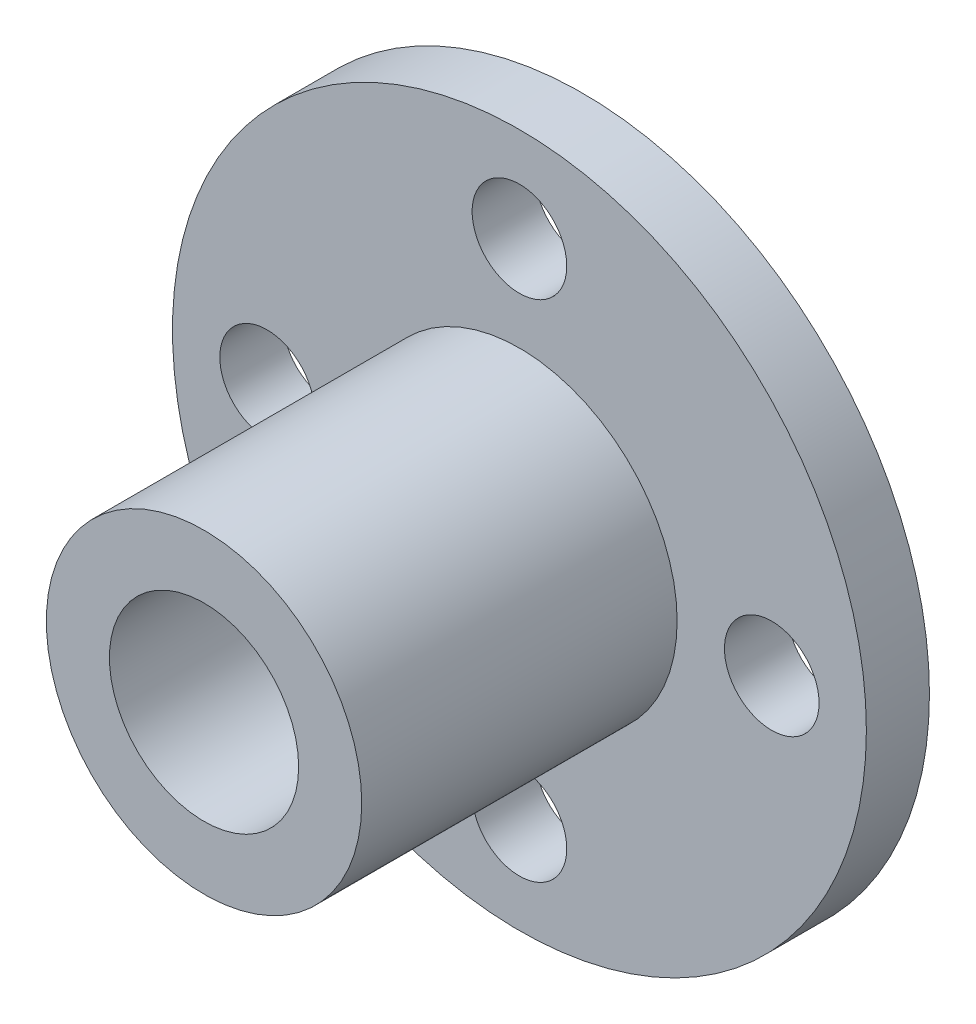
ISO-10303-21;
HEADER;
FILE_DESCRIPTION(('STEP AP214'),'2;1');
FILE_NAME('part.step','',(''),(''),'','','');
FILE_SCHEMA(('AUTOMOTIVE_DESIGN { 1 0 10303 214 1 1 1 1 }'));
ENDSEC;
DATA;
#1=APPLICATION_CONTEXT('core data for automotive mechanical design processes');
#2=APPLICATION_PROTOCOL_DEFINITION('international standard','automotive_design',2000,#1);
#3=PRODUCT_CONTEXT('',#1,'mechanical');
#4=PRODUCT('Part','Part','',(#3));
#5=PRODUCT_RELATED_PRODUCT_CATEGORY('part','',(#4));
#6=PRODUCT_DEFINITION_FORMATION('','',#4);
#7=PRODUCT_DEFINITION_CONTEXT('part definition',#1,'design');
#8=PRODUCT_DEFINITION('design','',#6,#7);
#9=PRODUCT_DEFINITION_SHAPE('','',#8);
#10=(LENGTH_UNIT() NAMED_UNIT(*) SI_UNIT(.MILLI.,.METRE.));
#11=(NAMED_UNIT(*) PLANE_ANGLE_UNIT() SI_UNIT($,.RADIAN.));
#12=(NAMED_UNIT(*) SI_UNIT($,.STERADIAN.) SOLID_ANGLE_UNIT());
#13=UNCERTAINTY_MEASURE_WITH_UNIT(LENGTH_MEASURE(1.E-05),#10,'distance_accuracy_value','');
#14=(GEOMETRIC_REPRESENTATION_CONTEXT(3) GLOBAL_UNCERTAINTY_ASSIGNED_CONTEXT((#13)) GLOBAL_UNIT_ASSIGNED_CONTEXT((#10,
#11,#12)) REPRESENTATION_CONTEXT('',''));
#15=CARTESIAN_POINT('',(0.,0.,0.));
#16=DIRECTION('',(0.,0.,1.));
#17=DIRECTION('',(1.,0.,0.));
#18=AXIS2_PLACEMENT_3D('',#15,#16,#17);
#19=CARTESIAN_POINT('',(0.,0.,2.));
#20=DIRECTION('',(0.,0.,1.));
#21=DIRECTION('',(1.,0.,0.));
#22=AXIS2_PLACEMENT_3D('',#19,#20,#21);
#23=PLANE('',#22);
#24=CARTESIAN_POINT('',(0.,0.,2.));
#25=DIRECTION('',(0.,0.,1.));
#26=DIRECTION('',(1.,0.,0.));
#27=AXIS2_PLACEMENT_3D('',#24,#25,#26);
#28=CIRCLE('',#27,5.);
#29=CARTESIAN_POINT('',(5.,0.,2.));
#30=VERTEX_POINT('',#29);
#31=EDGE_CURVE('E75',#30,#30,#28,.T.);
#32=ORIENTED_EDGE('',*,*,#31,.F.);
#33=EDGE_LOOP('',(#32));
#34=FACE_BOUND('',#33,.T.);
#35=CARTESIAN_POINT('',(0.,-8.,2.));
#36=DIRECTION('',(0.,0.,1.));
#37=DIRECTION('',(1.,0.,0.));
#38=AXIS2_PLACEMENT_3D('',#35,#36,#37);
#39=CIRCLE('',#38,1.5);
#40=CARTESIAN_POINT('',(1.5,-8.,2.));
#41=VERTEX_POINT('',#40);
#42=EDGE_CURVE('E60',#41,#41,#39,.T.);
#43=ORIENTED_EDGE('',*,*,#42,.F.);
#44=EDGE_LOOP('',(#43));
#45=FACE_BOUND('',#44,.T.);
#46=CARTESIAN_POINT('',(0.,8.,2.));
#47=DIRECTION('',(0.,0.,1.));
#48=DIRECTION('',(1.,0.,0.));
#49=AXIS2_PLACEMENT_3D('',#46,#47,#48);
#50=CIRCLE('',#49,1.5);
#51=CARTESIAN_POINT('',(1.5,8.,2.));
#52=VERTEX_POINT('',#51);
#53=EDGE_CURVE('E49',#52,#52,#50,.T.);
#54=ORIENTED_EDGE('',*,*,#53,.F.);
#55=EDGE_LOOP('',(#54));
#56=FACE_BOUND('',#55,.T.);
#57=CARTESIAN_POINT('',(0.,0.,2.));
#58=DIRECTION('',(0.,0.,1.));
#59=DIRECTION('',(1.,0.,0.));
#60=AXIS2_PLACEMENT_3D('',#57,#58,#59);
#61=CIRCLE('',#60,11.);
#62=CARTESIAN_POINT('',(11.,0.,2.));
#63=VERTEX_POINT('',#62);
#64=EDGE_CURVE('E10',#63,#63,#61,.T.);
#65=ORIENTED_EDGE('',*,*,#64,.T.);
#66=EDGE_LOOP('',(#65));
#67=FACE_BOUND('',#66,.T.);
#68=CARTESIAN_POINT('',(8.,0.,2.));
#69=DIRECTION('',(0.,0.,1.));
#70=DIRECTION('',(1.,0.,0.));
#71=AXIS2_PLACEMENT_3D('',#68,#69,#70);
#72=CIRCLE('',#71,1.5);
#73=CARTESIAN_POINT('',(9.5,0.,2.));
#74=VERTEX_POINT('',#73);
#75=EDGE_CURVE('E54',#74,#74,#72,.T.);
#76=ORIENTED_EDGE('',*,*,#75,.F.);
#77=EDGE_LOOP('',(#76));
#78=FACE_BOUND('',#77,.T.);
#79=CARTESIAN_POINT('',(-8.,0.,2.));
#80=DIRECTION('',(0.,0.,1.));
#81=DIRECTION('',(1.,0.,0.));
#82=AXIS2_PLACEMENT_3D('',#79,#80,#81);
#83=CIRCLE('',#82,1.5);
#84=CARTESIAN_POINT('',(-6.5,0.,2.));
#85=VERTEX_POINT('',#84);
#86=EDGE_CURVE('E66',#85,#85,#83,.T.);
#87=ORIENTED_EDGE('',*,*,#86,.F.);
#88=EDGE_LOOP('',(#87));
#89=FACE_BOUND('',#88,.T.);
#90=ADVANCED_FACE('F38',(#34,#45,#56,#67,#78,#89),#23,.T.);
#91=CARTESIAN_POINT('',(0.,0.,0.));
#92=DIRECTION('',(0.,0.,1.));
#93=DIRECTION('',(1.,0.,0.));
#94=AXIS2_PLACEMENT_3D('',#91,#92,#93);
#95=PLANE('',#94);
#96=CARTESIAN_POINT('',(0.,0.,0.));
#97=DIRECTION('',(0.,0.,1.));
#98=DIRECTION('',(1.,0.,0.));
#99=AXIS2_PLACEMENT_3D('',#96,#97,#98);
#100=CIRCLE('',#99,3.);
#101=CARTESIAN_POINT('',(3.,0.,0.));
#102=VERTEX_POINT('',#101);
#103=EDGE_CURVE('E83',#102,#102,#100,.T.);
#104=ORIENTED_EDGE('',*,*,#103,.T.);
#105=EDGE_LOOP('',(#104));
#106=FACE_BOUND('',#105,.T.);
#107=CARTESIAN_POINT('',(0.,0.,0.));
#108=DIRECTION('',(0.,0.,1.));
#109=DIRECTION('',(1.,0.,0.));
#110=AXIS2_PLACEMENT_3D('',#107,#108,#109);
#111=CIRCLE('',#110,11.);
#112=CARTESIAN_POINT('',(11.,0.,0.));
#113=VERTEX_POINT('',#112);
#114=EDGE_CURVE('E42',#113,#113,#111,.T.);
#115=ORIENTED_EDGE('',*,*,#114,.F.);
#116=EDGE_LOOP('',(#115));
#117=FACE_BOUND('',#116,.T.);
#118=CARTESIAN_POINT('',(0.,8.,0.));
#119=DIRECTION('',(0.,0.,1.));
#120=DIRECTION('',(1.,0.,0.));
#121=AXIS2_PLACEMENT_3D('',#118,#119,#120);
#122=CIRCLE('',#121,1.5);
#123=CARTESIAN_POINT('',(1.5,8.,0.));
#124=VERTEX_POINT('',#123);
#125=EDGE_CURVE('E51',#124,#124,#122,.T.);
#126=ORIENTED_EDGE('',*,*,#125,.T.);
#127=EDGE_LOOP('',(#126));
#128=FACE_BOUND('',#127,.T.);
#129=CARTESIAN_POINT('',(8.,0.,0.));
#130=DIRECTION('',(0.,0.,1.));
#131=DIRECTION('',(1.,0.,0.));
#132=AXIS2_PLACEMENT_3D('',#129,#130,#131);
#133=CIRCLE('',#132,1.5);
#134=CARTESIAN_POINT('',(9.5,0.,0.));
#135=VERTEX_POINT('',#134);
#136=EDGE_CURVE('E57',#135,#135,#133,.T.);
#137=ORIENTED_EDGE('',*,*,#136,.T.);
#138=EDGE_LOOP('',(#137));
#139=FACE_BOUND('',#138,.T.);
#140=CARTESIAN_POINT('',(0.,-8.,0.));
#141=DIRECTION('',(0.,0.,1.));
#142=DIRECTION('',(1.,0.,0.));
#143=AXIS2_PLACEMENT_3D('',#140,#141,#142);
#144=CIRCLE('',#143,1.5);
#145=CARTESIAN_POINT('',(1.5,-8.,0.));
#146=VERTEX_POINT('',#145);
#147=EDGE_CURVE('E63',#146,#146,#144,.T.);
#148=ORIENTED_EDGE('',*,*,#147,.T.);
#149=EDGE_LOOP('',(#148));
#150=FACE_BOUND('',#149,.T.);
#151=CARTESIAN_POINT('',(-8.,0.,0.));
#152=DIRECTION('',(0.,0.,1.));
#153=DIRECTION('',(1.,0.,0.));
#154=AXIS2_PLACEMENT_3D('',#151,#152,#153);
#155=CIRCLE('',#154,1.5);
#156=CARTESIAN_POINT('',(-6.5,0.,0.));
#157=VERTEX_POINT('',#156);
#158=EDGE_CURVE('E69',#157,#157,#155,.T.);
#159=ORIENTED_EDGE('',*,*,#158,.T.);
#160=EDGE_LOOP('',(#159));
#161=FACE_BOUND('',#160,.T.);
#162=ADVANCED_FACE('F87',(#106,#117,#128,#139,#150,#161),#95,.F.);
#163=CARTESIAN_POINT('',(0.,0.,2.));
#164=DIRECTION('',(0.,0.,-1.));
#165=DIRECTION('',(-1.,0.,0.));
#166=AXIS2_PLACEMENT_3D('',#163,#164,#165);
#167=CYLINDRICAL_SURFACE('',#166,11.);
#168=ORIENTED_EDGE('',*,*,#64,.F.);
#169=EDGE_LOOP('',(#168));
#170=FACE_BOUND('',#169,.T.);
#171=ORIENTED_EDGE('',*,*,#114,.T.);
#172=EDGE_LOOP('',(#171));
#173=FACE_BOUND('',#172,.T.);
#174=ADVANCED_FACE('F40',(#170,#173),#167,.T.);
#175=CARTESIAN_POINT('',(0.,8.,2.));
#176=DIRECTION('',(0.,0.,-1.));
#177=DIRECTION('',(-1.,0.,0.));
#178=AXIS2_PLACEMENT_3D('',#175,#176,#177);
#179=CYLINDRICAL_SURFACE('',#178,1.5);
#180=ORIENTED_EDGE('',*,*,#53,.T.);
#181=EDGE_LOOP('',(#180));
#182=FACE_BOUND('',#181,.T.);
#183=ORIENTED_EDGE('',*,*,#125,.F.);
#184=EDGE_LOOP('',(#183));
#185=FACE_BOUND('',#184,.T.);
#186=ADVANCED_FACE('F111',(#182,#185),#179,.F.);
#187=CARTESIAN_POINT('',(8.,0.,2.));
#188=DIRECTION('',(0.,0.,-1.));
#189=DIRECTION('',(-1.,0.,0.));
#190=AXIS2_PLACEMENT_3D('',#187,#188,#189);
#191=CYLINDRICAL_SURFACE('',#190,1.5);
#192=ORIENTED_EDGE('',*,*,#75,.T.);
#193=EDGE_LOOP('',(#192));
#194=FACE_BOUND('',#193,.T.);
#195=ORIENTED_EDGE('',*,*,#136,.F.);
#196=EDGE_LOOP('',(#195));
#197=FACE_BOUND('',#196,.T.);
#198=ADVANCED_FACE('F114',(#194,#197),#191,.F.);
#199=CARTESIAN_POINT('',(0.,-8.,2.));
#200=DIRECTION('',(0.,0.,-1.));
#201=DIRECTION('',(-1.,0.,0.));
#202=AXIS2_PLACEMENT_3D('',#199,#200,#201);
#203=CYLINDRICAL_SURFACE('',#202,1.5);
#204=ORIENTED_EDGE('',*,*,#42,.T.);
#205=EDGE_LOOP('',(#204));
#206=FACE_BOUND('',#205,.T.);
#207=ORIENTED_EDGE('',*,*,#147,.F.);
#208=EDGE_LOOP('',(#207));
#209=FACE_BOUND('',#208,.T.);
#210=ADVANCED_FACE('F118',(#206,#209),#203,.F.);
#211=CARTESIAN_POINT('',(-8.,0.,2.));
#212=DIRECTION('',(0.,0.,-1.));
#213=DIRECTION('',(-1.,0.,0.));
#214=AXIS2_PLACEMENT_3D('',#211,#212,#213);
#215=CYLINDRICAL_SURFACE('',#214,1.5);
#216=ORIENTED_EDGE('',*,*,#86,.T.);
#217=EDGE_LOOP('',(#216));
#218=FACE_BOUND('',#217,.T.);
#219=ORIENTED_EDGE('',*,*,#158,.F.);
#220=EDGE_LOOP('',(#219));
#221=FACE_BOUND('',#220,.T.);
#222=ADVANCED_FACE('F122',(#218,#221),#215,.F.);
#223=CARTESIAN_POINT('',(0.,0.,12.));
#224=DIRECTION('',(0.,0.,1.));
#225=DIRECTION('',(1.,0.,0.));
#226=AXIS2_PLACEMENT_3D('',#223,#224,#225);
#227=PLANE('',#226);
#228=CARTESIAN_POINT('',(0.,0.,12.));
#229=DIRECTION('',(0.,0.,1.));
#230=DIRECTION('',(1.,0.,0.));
#231=AXIS2_PLACEMENT_3D('',#228,#229,#230);
#232=CIRCLE('',#231,5.);
#233=CARTESIAN_POINT('',(5.,0.,12.));
#234=VERTEX_POINT('',#233);
#235=EDGE_CURVE('E72',#234,#234,#232,.T.);
#236=ORIENTED_EDGE('',*,*,#235,.T.);
#237=EDGE_LOOP('',(#236));
#238=FACE_BOUND('',#237,.T.);
#239=CARTESIAN_POINT('',(0.,0.,12.));
#240=DIRECTION('',(0.,0.,1.));
#241=DIRECTION('',(1.,0.,0.));
#242=AXIS2_PLACEMENT_3D('',#239,#240,#241);
#243=CIRCLE('',#242,3.);
#244=CARTESIAN_POINT('',(3.,0.,12.));
#245=VERTEX_POINT('',#244);
#246=EDGE_CURVE('E78',#245,#245,#243,.T.);
#247=ORIENTED_EDGE('',*,*,#246,.F.);
#248=EDGE_LOOP('',(#247));
#249=FACE_BOUND('',#248,.T.);
#250=ADVANCED_FACE('F98',(#238,#249),#227,.T.);
#251=CARTESIAN_POINT('',(0.,0.,12.));
#252=DIRECTION('',(0.,0.,-1.));
#253=DIRECTION('',(-1.,0.,0.));
#254=AXIS2_PLACEMENT_3D('',#251,#252,#253);
#255=CYLINDRICAL_SURFACE('',#254,5.);
#256=ORIENTED_EDGE('',*,*,#235,.F.);
#257=EDGE_LOOP('',(#256));
#258=FACE_BOUND('',#257,.T.);
#259=ORIENTED_EDGE('',*,*,#31,.T.);
#260=EDGE_LOOP('',(#259));
#261=FACE_BOUND('',#260,.T.);
#262=ADVANCED_FACE('F92',(#258,#261),#255,.T.);
#263=CARTESIAN_POINT('',(0.,0.,12.));
#264=DIRECTION('',(0.,0.,-1.));
#265=DIRECTION('',(-1.,0.,0.));
#266=AXIS2_PLACEMENT_3D('',#263,#264,#265);
#267=CYLINDRICAL_SURFACE('',#266,3.);
#268=ORIENTED_EDGE('',*,*,#246,.T.);
#269=EDGE_LOOP('',(#268));
#270=FACE_BOUND('',#269,.T.);
#271=ORIENTED_EDGE('',*,*,#103,.F.);
#272=EDGE_LOOP('',(#271));
#273=FACE_BOUND('',#272,.T.);
#274=ADVANCED_FACE('F90',(#270,#273),#267,.F.);
#275=CLOSED_SHELL('',(#90,#162,#174,#186,#198,#210,#222,#250,#262,#274));
#276=MANIFOLD_SOLID_BREP('B2',#275);
#277=ADVANCED_BREP_SHAPE_REPRESENTATION('',(#18,#276),#14);
#278=SHAPE_DEFINITION_REPRESENTATION(#9,#277);
ENDSEC;
END-ISO-10303-21;
